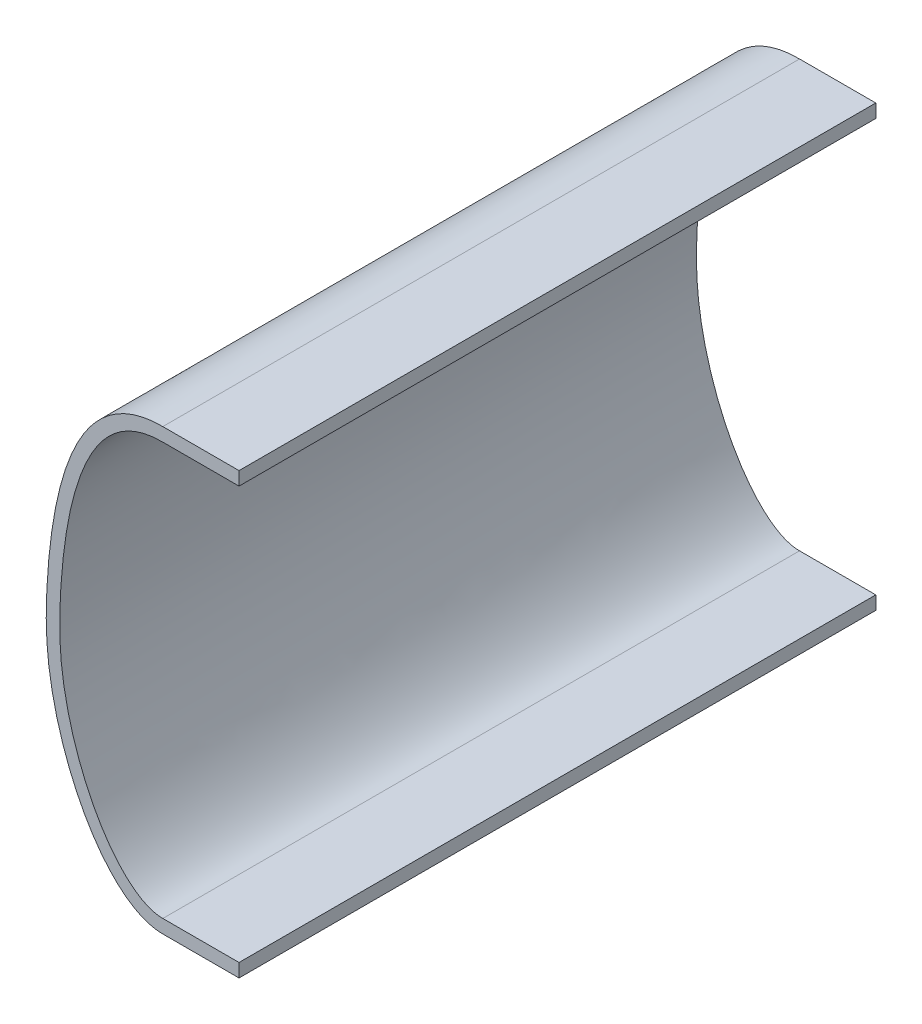
ISO-10303-21;
HEADER;
FILE_DESCRIPTION(('STEP AP214'),'2;1');
FILE_NAME('part.step','',(''),(''),'','','');
FILE_SCHEMA(('AUTOMOTIVE_DESIGN { 1 0 10303 214 1 1 1 1 }'));
ENDSEC;
DATA;
#1=APPLICATION_CONTEXT('core data for automotive mechanical design processes');
#2=APPLICATION_PROTOCOL_DEFINITION('international standard','automotive_design',2000,#1);
#3=PRODUCT_CONTEXT('',#1,'mechanical');
#4=PRODUCT('Part','Part','',(#3));
#5=PRODUCT_RELATED_PRODUCT_CATEGORY('part','',(#4));
#6=PRODUCT_DEFINITION_FORMATION('','',#4);
#7=PRODUCT_DEFINITION_CONTEXT('part definition',#1,'design');
#8=PRODUCT_DEFINITION('design','',#6,#7);
#9=PRODUCT_DEFINITION_SHAPE('','',#8);
#10=(LENGTH_UNIT() NAMED_UNIT(*) SI_UNIT(.MILLI.,.METRE.));
#11=(NAMED_UNIT(*) PLANE_ANGLE_UNIT() SI_UNIT($,.RADIAN.));
#12=(NAMED_UNIT(*) SI_UNIT($,.STERADIAN.) SOLID_ANGLE_UNIT());
#13=UNCERTAINTY_MEASURE_WITH_UNIT(LENGTH_MEASURE(1.E-05),#10,'distance_accuracy_value','');
#14=(GEOMETRIC_REPRESENTATION_CONTEXT(3) GLOBAL_UNCERTAINTY_ASSIGNED_CONTEXT((#13)) GLOBAL_UNIT_ASSIGNED_CONTEXT((#10,
#11,#12)) REPRESENTATION_CONTEXT('',''));
#15=CARTESIAN_POINT('',(0.,0.,0.));
#16=DIRECTION('',(0.,0.,1.));
#17=DIRECTION('',(1.,0.,0.));
#18=AXIS2_PLACEMENT_3D('',#15,#16,#17);
#19=CARTESIAN_POINT('',(-12.9682498047054,-1.92899742460644,71.));
#20=DIRECTION('',(0.,0.,-1.));
#21=DIRECTION('',(-1.,0.,0.));
#22=AXIS2_PLACEMENT_3D('',#19,#20,#21);
#23=PLANE('',#22);
#24=DIRECTION('',(1.,0.,0.));
#25=VECTOR('',#24,1.);
#26=CARTESIAN_POINT('',(0.,-24.5,71.));
#27=LINE('',#26,#25);
#28=CARTESIAN_POINT('',(0.,-24.5,71.));
#29=VERTEX_POINT('',#28);
#30=CARTESIAN_POINT('',(8.5,-24.5,71.));
#31=VERTEX_POINT('',#30);
#32=EDGE_CURVE('E151',#29,#31,#27,.T.);
#33=ORIENTED_EDGE('',*,*,#32,.T.);
#34=DIRECTION('',(0.,-1.,0.));
#35=VECTOR('',#34,1.);
#36=CARTESIAN_POINT('',(8.5,-24.5,71.));
#37=LINE('',#36,#35);
#38=CARTESIAN_POINT('',(8.5,-23.,71.));
#39=VERTEX_POINT('',#38);
#40=EDGE_CURVE('E155',#39,#31,#37,.T.);
#41=ORIENTED_EDGE('',*,*,#40,.F.);
#42=DIRECTION('',(1.,0.,0.));
#43=VECTOR('',#42,1.);
#44=CARTESIAN_POINT('',(-12.9682498047054,-23.,71.));
#45=LINE('',#44,#43);
#46=CARTESIAN_POINT('',(0.,-23.,71.));
#47=VERTEX_POINT('',#46);
#48=EDGE_CURVE('E169',#47,#39,#45,.T.);
#49=ORIENTED_EDGE('',*,*,#48,.F.);
#50=CARTESIAN_POINT('',(-0.0067237222128259,23.0000150695558,71.));
#51=CARTESIAN_POINT('',(-0.192366832997696,23.0008546297267,71.));
#52=CARTESIAN_POINT('',(-0.378081324979994,22.9968100373749,71.));
#53=CARTESIAN_POINT('',(-0.749414780629934,22.978166952676,71.));
#54=CARTESIAN_POINT('',(-0.93503246874514,22.9635434054905,71.));
#55=CARTESIAN_POINT('',(-1.30516858467917,22.9229319734162,71.));
#56=CARTESIAN_POINT('',(-1.48968619773364,22.8969365236255,71.));
#57=CARTESIAN_POINT('',(-1.85552329195587,22.8331178972839,71.));
#58=CARTESIAN_POINT('',(-2.03685539423349,22.7953675614577,71.));
#59=CARTESIAN_POINT('',(-2.39637488909223,22.7075499226121,71.));
#60=CARTESIAN_POINT('',(-2.57456462669481,22.657492260478,71.));
#61=CARTESIAN_POINT('',(-2.92685115288084,22.5448350330184,71.));
#62=CARTESIAN_POINT('',(-3.10094997613518,22.4822418565243,71.));
#63=CARTESIAN_POINT('',(-3.41468310176381,22.3563808576733,71.));
#64=CARTESIAN_POINT('',(-3.55510623896814,22.2950707886957,71.));
#65=CARTESIAN_POINT('',(-3.83201521613293,22.1640627278335,71.));
#66=CARTESIAN_POINT('',(-3.96850042278436,22.0943633959832,71.));
#67=CARTESIAN_POINT('',(-4.23703909832444,21.9469189732133,71.));
#68=CARTESIAN_POINT('',(-4.36909281630143,21.8691743355166,71.));
#69=CARTESIAN_POINT('',(-4.6282725576667,21.7061680631713,71.));
#70=CARTESIAN_POINT('',(-4.75540370288977,21.6209145613641,71.));
#71=CARTESIAN_POINT('',(-5.00463112246702,21.44334043489,71.));
#72=CARTESIAN_POINT('',(-5.12672727320093,21.351019636864,71.));
#73=CARTESIAN_POINT('',(-5.36572440271767,21.1598935200268,71.));
#74=CARTESIAN_POINT('',(-5.48262501373589,21.0610877434007,71.));
#75=CARTESIAN_POINT('',(-5.82029725638975,20.7603932662982,71.));
#76=CARTESIAN_POINT('',(-6.03368975096213,20.5501447989969,71.));
#77=CARTESIAN_POINT('',(-6.44074564106537,20.1114124282747,71.));
#78=CARTESIAN_POINT('',(-6.63440141721629,19.8829215426007,71.));
#79=CARTESIAN_POINT('',(-7.00360047745452,19.4108913646842,71.));
#80=CARTESIAN_POINT('',(-7.179096394388,19.1673152421571,71.));
#81=CARTESIAN_POINT('',(-7.51298857097708,18.6686368830764,71.));
#82=CARTESIAN_POINT('',(-7.67137734850881,18.4135296718257,71.));
#83=CARTESIAN_POINT('',(-7.95821610765031,17.9190729889317,71.));
#84=CARTESIAN_POINT('',(-8.08808076049961,17.6805380296065,71.));
#85=CARTESIAN_POINT('',(-8.336175040644,17.1975703481683,71.));
#86=CARTESIAN_POINT('',(-8.45440678192776,16.9531387077189,71.));
#87=CARTESIAN_POINT('',(-8.68041752168708,16.4592496536412,71.));
#88=CARTESIAN_POINT('',(-8.78818717240764,16.2097879817206,71.));
#89=CARTESIAN_POINT('',(-8.99412861639643,15.706913487957,71.));
#90=CARTESIAN_POINT('',(-9.09229921664335,15.45350017951,71.));
#91=CARTESIAN_POINT('',(-9.28026669134814,14.9424394409844,71.));
#92=CARTESIAN_POINT('',(-9.37002829461672,14.6847790796443,71.));
#93=CARTESIAN_POINT('',(-9.54150403499461,14.1667863209018,71.));
#94=CARTESIAN_POINT('',(-9.62321752511783,13.9064537105325,71.));
#95=CARTESIAN_POINT('',(-9.85722629573104,13.122530274208,71.));
#96=CARTESIAN_POINT('',(-9.99852588904571,12.5956368300576,71.));
#97=CARTESIAN_POINT('',(-10.2476470781712,11.5716228833243,71.));
#98=CARTESIAN_POINT('',(-10.3570823633811,11.0748868439966,71.));
#99=CARTESIAN_POINT('',(-10.5573526325667,10.0775502634303,71.));
#100=CARTESIAN_POINT('',(-10.6481822087466,9.57694864239852,71.));
#101=CARTESIAN_POINT('',(-10.8136566744431,8.57264519976476,71.));
#102=CARTESIAN_POINT('',(-10.8882869853104,8.06894100170128,71.));
#103=CARTESIAN_POINT('',(-11.0232880945788,7.05910585715523,71.));
#104=CARTESIAN_POINT('',(-11.0836438994721,6.55297292374723,71.));
#105=CARTESIAN_POINT('',(-11.1916648516991,5.53890937941022,71.));
#106=CARTESIAN_POINT('',(-11.2393186116798,5.03097756631906,71.));
#107=CARTESIAN_POINT('',(-11.3231338703998,4.01582395720004,71.));
#108=CARTESIAN_POINT('',(-11.3593318107429,3.50860512549087,71.));
#109=CARTESIAN_POINT('',(-11.4214979728738,2.49377840852157,71.));
#110=CARTESIAN_POINT('',(-11.4474711518151,1.98617083163078,71.));
#111=CARTESIAN_POINT('',(-11.4853459695188,0.970940117833149,71.));
#112=CARTESIAN_POINT('',(-11.4972628184678,0.463317593238425,71.));
#113=CARTESIAN_POINT('',(-11.5032328448863,-0.551484559935823,71.));
#114=CARTESIAN_POINT('',(-11.4973065732515,-1.05866402556206,71.));
#115=CARTESIAN_POINT('',(-11.4640818714594,-2.0721508369861,71.));
#116=CARTESIAN_POINT('',(-11.4367936494271,-2.57845848360947,71.));
#117=CARTESIAN_POINT('',(-11.3747591004833,-3.37286680421284,71.));
#118=CARTESIAN_POINT('',(-11.3482023174521,-3.6616216146964,71.));
#119=CARTESIAN_POINT('',(-11.287245160599,-4.23831037071538,71.));
#120=CARTESIAN_POINT('',(-11.2528446002562,-4.52624429656571,71.));
#121=CARTESIAN_POINT('',(-11.1764772610491,-5.10134451669799,71.));
#122=CARTESIAN_POINT('',(-11.1345043342422,-5.38850999339497,71.));
#123=CARTESIAN_POINT('',(-11.0432188620203,-5.96166283820638,71.));
#124=CARTESIAN_POINT('',(-10.9939063516735,-6.24765021194304,71.));
#125=CARTESIAN_POINT('',(-10.8351976547267,-7.10385122509279,71.));
#126=CARTESIAN_POINT('',(-10.7150564321735,-7.6721087087319,71.));
#127=CARTESIAN_POINT('',(-10.4471576860583,-8.80188883127782,71.));
#128=CARTESIAN_POINT('',(-10.2994072032439,-9.36341314847172,71.));
#129=CARTESIAN_POINT('',(-9.97667564827007,-10.4783527960196,71.));
#130=CARTESIAN_POINT('',(-9.80170510733444,-11.0317711722729,71.));
#131=CARTESIAN_POINT('',(-9.42428852677707,-12.1289683011289,71.));
#132=CARTESIAN_POINT('',(-9.22185306016107,-12.6727506726121,71.));
#133=CARTESIAN_POINT('',(-8.87275276066148,-13.5395944437552,71.));
#134=CARTESIAN_POINT('',(-8.73500639052666,-13.8662693878685,71.));
#135=CARTESIAN_POINT('',(-8.44848386503039,-14.5147468011459,71.));
#136=CARTESIAN_POINT('',(-8.29970816558898,-14.8365494710539,71.));
#137=CARTESIAN_POINT('',(-7.99058496512768,-15.4746452148469,71.));
#138=CARTESIAN_POINT('',(-7.83023490663882,-15.7909370517751,71.));
#139=CARTESIAN_POINT('',(-7.49780502382129,-16.4161223195863,71.));
#140=CARTESIAN_POINT('',(-7.32576105288487,-16.7250347599624,71.));
#141=CARTESIAN_POINT('',(-6.96869145917153,-17.3352156315036,71.));
#142=CARTESIAN_POINT('',(-6.78366795096419,-17.636485296957,71.));
#143=CARTESIAN_POINT('',(-6.39958475836825,-18.2297995528744,71.));
#144=CARTESIAN_POINT('',(-6.2005316687875,-18.5218483854692,71.));
#145=CARTESIAN_POINT('',(-5.8562225196091,-18.9987524473473,71.));
#146=CARTESIAN_POINT('',(-5.71529040728835,-19.1867343251108,71.));
#147=CARTESIAN_POINT('',(-5.42604957330647,-19.5569447688719,71.));
#148=CARTESIAN_POINT('',(-5.27774114885586,-19.739173566193,71.));
#149=CARTESIAN_POINT('',(-4.9727980624514,-20.0972807591802,71.));
#150=CARTESIAN_POINT('',(-4.81614485747261,-20.2731434180868,71.));
#151=CARTESIAN_POINT('',(-4.49413917132932,-20.6167377936746,71.));
#152=CARTESIAN_POINT('',(-4.32878706850327,-20.7844698633683,71.));
#153=CARTESIAN_POINT('',(-3.98665675806066,-21.1119070287886,71.));
#154=CARTESIAN_POINT('',(-3.80977047276174,-21.2714998843713,71.));
#155=CARTESIAN_POINT('',(-3.44530509851409,-21.5782235763295,71.));
#156=CARTESIAN_POINT('',(-3.25772167276122,-21.7253492973546,71.));
#157=CARTESIAN_POINT('',(-2.87154990444394,-22.0033305917676,71.));
#158=CARTESIAN_POINT('',(-2.67299484082507,-22.1342318397308,71.));
#159=CARTESIAN_POINT('',(-2.26398799793538,-22.3755123521202,71.));
#160=CARTESIAN_POINT('',(-2.05355098698039,-22.4859163912903,71.));
#161=CARTESIAN_POINT('',(-1.60851505050753,-22.6854599998364,71.));
#162=CARTESIAN_POINT('',(-1.37322461042806,-22.7731195350819,71.));
#163=CARTESIAN_POINT('',(-1.01249083276969,-22.8751603672564,71.));
#164=CARTESIAN_POINT('',(-0.891141440386347,-22.9042434113953,71.));
#165=CARTESIAN_POINT('',(-0.64635996052923,-22.9514815231774,71.));
#166=CARTESIAN_POINT('',(-0.522929503359543,-22.9696447705576,71.));
#167=CARTESIAN_POINT('',(-0.332694364203668,-22.988333682568,71.));
#168=CARTESIAN_POINT('',(-0.266288721091866,-22.9931339942946,71.));
#169=CARTESIAN_POINT('',(-0.133255723534586,-22.9992210568768,71.));
#170=CARTESIAN_POINT('',(-0.0666282206243654,-23.0005045464424,71.));
#171=CARTESIAN_POINT('',(-1.35392194715788E-07,-22.9999760442149,71.));
#172=B_SPLINE_CURVE_WITH_KNOTS('',3,(#50,#51,#52,#53,#54,#55,#56,#57,#58,#59,#60,#61,#62,#63,
#64,#65,#66,#67,#68,#69,#70,#71,#72,#73,#74,#75,#76,#77,#78,#79,#80,#81,#82,#83,#84,#85,#86,#87,
#88,#89,#90,#91,#92,#93,#94,#95,#96,#97,#98,#99,#100,#101,#102,#103,#104,#105,#106,#107,#108,
#109,#110,#111,#112,#113,#114,#115,#116,#117,#118,#119,#120,#121,#122,#123,#124,#125,#126,#127,
#128,#129,#130,#131,#132,#133,#134,#135,#136,#137,#138,#139,#140,#141,#142,#143,#144,#145,#146,
#147,#148,#149,#150,#151,#152,#153,#154,#155,#156,#157,#158,#159,#160,#161,#162,#163,#164,#165,
#166,#167,#168,#169,#170,#171),.UNSPECIFIED.,.F.,.F.,(4,2,2,2,2,2,2,2,2,2,2,2,2,2,2,2,2,2,2,2,2,
2,2,2,2,2,2,2,2,2,2,2,2,2,2,2,2,2,2,2,2,2,2,2,2,2,2,2,2,2,2,2,2,2,2,2,2,2,2,2,4),(0.,
0.556944646545095,1.11521267842954,1.67385265162518,2.22909760321496,2.78390898442731,
3.3384383176311,3.79783969346874,4.25731454429792,4.7167635252241,5.17572085717688,
5.63468945084841,6.09369048089006,6.990882463534,7.88841950639592,8.78824155872311,
9.68845558465935,10.5028978905197,11.3171919175808,12.1322069366683,12.9473231217671,
13.7657180607754,14.5841787367712,16.2198995435685,17.7454676431648,19.2714785257479,
20.7988571108726,22.3278329529317,23.8581749427675,25.3835987240138,26.9082820380799,
28.4313139925844,29.9525924593499,31.473144404064,32.3429638026875,33.2128038873227,
34.0833533924767,34.9538987383072,36.6955791242759,38.4368159620296,40.1773807968517,
41.9172774682489,42.9806879563856,44.0440545107453,45.1076567499797,46.1681335195434,
47.2284379203016,48.2882471915909,48.992924221128,49.6975728803878,50.4038585765384,
51.1101135797816,51.8243562934168,52.538890660854,53.2513654611034,53.962973413455,
54.7132184295362,55.0871787477527,55.4608585918109,55.6605125421793,55.8603515770891),.UNSPECIFIED.);
#173=CARTESIAN_POINT('',(-0.00672372221282602,23.0000075347779,71.));
#174=VERTEX_POINT('',#173);
#175=EDGE_CURVE('E173',#174,#47,#172,.T.);
#176=ORIENTED_EDGE('',*,*,#175,.F.);
#177=DIRECTION('',(-1.,0.,0.));
#178=VECTOR('',#177,1.);
#179=CARTESIAN_POINT('',(-12.9682498047054,23.,71.));
#180=LINE('',#179,#178);
#181=CARTESIAN_POINT('',(8.5,23.,71.));
#182=VERTEX_POINT('',#181);
#183=EDGE_CURVE('E165',#182,#174,#180,.T.);
#184=ORIENTED_EDGE('',*,*,#183,.F.);
#185=CARTESIAN_POINT('',(8.5,24.5,71.));
#186=VERTEX_POINT('',#185);
#187=EDGE_CURVE('E322',#186,#182,#37,.T.);
#188=ORIENTED_EDGE('',*,*,#187,.F.);
#189=DIRECTION('',(-1.,0.,0.));
#190=VECTOR('',#189,1.);
#191=CARTESIAN_POINT('',(0.,24.5,71.));
#192=LINE('',#191,#190);
#193=CARTESIAN_POINT('',(0.,24.5,71.));
#194=VERTEX_POINT('',#193);
#195=EDGE_CURVE('E67',#186,#194,#192,.T.);
#196=ORIENTED_EDGE('',*,*,#195,.T.);
#197=CARTESIAN_POINT('',(0.,24.5,71.));
#198=CARTESIAN_POINT('',(-9.74950629472076,24.5437024204093,71.));
#199=CARTESIAN_POINT('',(-12.8855353719624,10.0094717866335,71.));
#200=CARTESIAN_POINT('',(-13.2157127188795,-11.5672719883067,71.));
#201=CARTESIAN_POINT('',(-6.10038745156015,-24.5344778885819,71.));
#202=CARTESIAN_POINT('',(0.,-24.5,71.));
#203=CARTESIAN_POINT('',(0.128019035688953,-24.4992764679155,71.));
#204=CARTESIAN_POINT('',(0.256038071377867,-24.4985529358311,71.));
#205=CARTESIAN_POINT('',(0.38405710706678,-24.4978294037466,71.));
#206=B_SPLINE_CURVE_WITH_KNOTS('',3,(#197,#198,#199,#200,#201,#202,#203,#204,#205),
.UNSPECIFIED.,.F.,.F.,(4,1,1,3,4),(0.,0.42347809693051,0.52347809693051,1.,1.01),.UNSPECIFIED.);
#207=EDGE_CURVE('E91',#194,#29,#206,.T.);
#208=ORIENTED_EDGE('',*,*,#207,.T.);
#209=EDGE_LOOP('',(#33,#41,#49,#176,#184,#188,#196,#208));
#210=FACE_BOUND('',#209,.T.);
#211=ADVANCED_FACE('F39',(#210),#23,.F.);
#212=DIRECTION('',(0.,0.,-1.));
#213=VECTOR('',#212,1.);
#214=SURFACE_OF_LINEAR_EXTRUSION('',#206,#213);
#215=CARTESIAN_POINT('',(0.,24.5,0.));
#216=CARTESIAN_POINT('',(-9.74950629472076,24.5437024204093,0.));
#217=CARTESIAN_POINT('',(-12.8855353719624,10.0094717866335,0.));
#218=CARTESIAN_POINT('',(-13.2157127188795,-11.5672719883067,0.));
#219=CARTESIAN_POINT('',(-6.10038745156015,-24.5344778885819,0.));
#220=CARTESIAN_POINT('',(0.,-24.5,0.));
#221=B_SPLINE_CURVE_WITH_KNOTS('',3,(#215,#216,#217,#218,#219,#220),.UNSPECIFIED.,.F.,.F.,(4,1,
1,4),(0.,0.42347809693051,0.52347809693051,1.),.UNSPECIFIED.);
#222=CARTESIAN_POINT('',(0.,24.5,0.));
#223=VERTEX_POINT('',#222);
#224=CARTESIAN_POINT('',(0.,-24.5,0.));
#225=VERTEX_POINT('',#224);
#226=EDGE_CURVE('E98',#223,#225,#221,.T.);
#227=ORIENTED_EDGE('',*,*,#226,.T.);
#228=DIRECTION('',(0.,0.,-1.));
#229=VECTOR('',#228,1.);
#230=CARTESIAN_POINT('',(0.,-24.5,71.));
#231=LINE('',#230,#229);
#232=EDGE_CURVE('E11',#29,#225,#231,.T.);
#233=ORIENTED_EDGE('',*,*,#232,.F.);
#234=ORIENTED_EDGE('',*,*,#207,.F.);
#235=DIRECTION('',(0.,0.,-1.));
#236=VECTOR('',#235,1.);
#237=CARTESIAN_POINT('',(0.,24.5,71.));
#238=LINE('',#237,#236);
#239=EDGE_CURVE('E50',#194,#223,#238,.T.);
#240=ORIENTED_EDGE('',*,*,#239,.T.);
#241=EDGE_LOOP('',(#227,#233,#234,#240));
#242=FACE_BOUND('',#241,.T.);
#243=ADVANCED_FACE('F96',(#242),#214,.F.);
#244=CARTESIAN_POINT('',(0.,-24.5,71.));
#245=DIRECTION('',(0.,1.,0.));
#246=DIRECTION('',(0.,0.,1.));
#247=AXIS2_PLACEMENT_3D('',#244,#245,#246);
#248=PLANE('',#247);
#249=DIRECTION('',(1.,0.,0.));
#250=VECTOR('',#249,1.);
#251=CARTESIAN_POINT('',(0.,-24.5,0.));
#252=LINE('',#251,#250);
#253=CARTESIAN_POINT('',(8.5,-24.5,0.));
#254=VERTEX_POINT('',#253);
#255=EDGE_CURVE('E92',#225,#254,#252,.T.);
#256=ORIENTED_EDGE('',*,*,#255,.T.);
#257=DIRECTION('',(0.,0.,1.));
#258=VECTOR('',#257,1.);
#259=CARTESIAN_POINT('',(8.5,-24.5,-0.0749250749250696));
#260=LINE('',#259,#258);
#261=EDGE_CURVE('E300',#254,#31,#260,.T.);
#262=ORIENTED_EDGE('',*,*,#261,.T.);
#263=ORIENTED_EDGE('',*,*,#32,.F.);
#264=ORIENTED_EDGE('',*,*,#232,.T.);
#265=EDGE_LOOP('',(#256,#262,#263,#264));
#266=FACE_BOUND('',#265,.T.);
#267=ADVANCED_FACE('F41',(#266),#248,.F.);
#268=CARTESIAN_POINT('',(0.,24.5,71.));
#269=DIRECTION('',(0.,-1.,0.));
#270=DIRECTION('',(0.,0.,-1.));
#271=AXIS2_PLACEMENT_3D('',#268,#269,#270);
#272=PLANE('',#271);
#273=ORIENTED_EDGE('',*,*,#195,.F.);
#274=DIRECTION('',(0.,0.,1.));
#275=VECTOR('',#274,1.);
#276=CARTESIAN_POINT('',(8.5,24.5,-0.0749250749250696));
#277=LINE('',#276,#275);
#278=CARTESIAN_POINT('',(8.5,24.5,0.));
#279=VERTEX_POINT('',#278);
#280=EDGE_CURVE('E87',#279,#186,#277,.T.);
#281=ORIENTED_EDGE('',*,*,#280,.F.);
#282=DIRECTION('',(-1.,0.,0.));
#283=VECTOR('',#282,1.);
#284=CARTESIAN_POINT('',(0.,24.5,0.));
#285=LINE('',#284,#283);
#286=EDGE_CURVE('E81',#279,#223,#285,.T.);
#287=ORIENTED_EDGE('',*,*,#286,.T.);
#288=ORIENTED_EDGE('',*,*,#239,.F.);
#289=EDGE_LOOP('',(#273,#281,#287,#288));
#290=FACE_BOUND('',#289,.T.);
#291=ADVANCED_FACE('F83',(#290),#272,.F.);
#292=CARTESIAN_POINT('',(-12.9682498047054,-1.92899742460644,0.));
#293=DIRECTION('',(0.,0.,-1.));
#294=DIRECTION('',(-1.,0.,0.));
#295=AXIS2_PLACEMENT_3D('',#292,#293,#294);
#296=PLANE('',#295);
#297=DIRECTION('',(0.,1.,0.));
#298=VECTOR('',#297,1.);
#299=CARTESIAN_POINT('',(8.5,-1.92899742460644,0.));
#300=LINE('',#299,#298);
#301=CARTESIAN_POINT('',(8.50000000000001,-23.,0.));
#302=VERTEX_POINT('',#301);
#303=EDGE_CURVE('E58',#254,#302,#300,.T.);
#304=ORIENTED_EDGE('',*,*,#303,.F.);
#305=ORIENTED_EDGE('',*,*,#255,.F.);
#306=ORIENTED_EDGE('',*,*,#226,.F.);
#307=ORIENTED_EDGE('',*,*,#286,.F.);
#308=CARTESIAN_POINT('',(8.5,23.,0.));
#309=VERTEX_POINT('',#308);
#310=EDGE_CURVE('E252',#309,#279,#300,.T.);
#311=ORIENTED_EDGE('',*,*,#310,.F.);
#312=DIRECTION('',(-0.999999999998431,1.77148762801781E-06,0.));
#313=VECTOR('',#312,1.);
#314=CARTESIAN_POINT('',(8.5,23.,0.));
#315=LINE('',#314,#313);
#316=CARTESIAN_POINT('',(-0.0067237222128259,23.0000150695558,0.));
#317=VERTEX_POINT('',#316);
#318=EDGE_CURVE('E249',#309,#317,#315,.T.);
#319=ORIENTED_EDGE('',*,*,#318,.T.);
#320=CARTESIAN_POINT('',(-0.00423878158636574,-23.,0.));
#321=CARTESIAN_POINT('',(-0.0759748044289641,-23.0004958272955,0.));
#322=CARTESIAN_POINT('',(-0.147717105417957,-22.9988822787626,0.));
#323=CARTESIAN_POINT('',(-0.29126649180994,-22.9915662319807,0.));
#324=CARTESIAN_POINT('',(-0.363072794664041,-22.9858482805008,0.));
#325=CARTESIAN_POINT('',(-0.507327483552532,-22.9703363866153,0.));
#326=CARTESIAN_POINT('',(-0.579769396014185,-22.9604827243402,0.));
#327=CARTESIAN_POINT('',(-0.725433160099027,-22.9366736617349,0.));
#328=CARTESIAN_POINT('',(-0.798642414327325,-22.9226415537605,0.));
#329=CARTESIAN_POINT('',(-0.945938299181167,-22.8904262632166,0.));
#330=CARTESIAN_POINT('',(-1.02000524111367,-22.8721534471097,0.));
#331=CARTESIAN_POINT('',(-1.16907521313707,-22.8313981183292,0.));
#332=CARTESIAN_POINT('',(-1.24405119879661,-22.8088170575237,0.));
#333=CARTESIAN_POINT('',(-1.39496075595967,-22.7593839066133,0.));
#334=CARTESIAN_POINT('',(-1.47086019290695,-22.732427962121,0.));
#335=CARTESIAN_POINT('',(-1.62360491261176,-22.674187986314,0.));
#336=CARTESIAN_POINT('',(-1.70040963629654,-22.642797905727,0.));
#337=CARTESIAN_POINT('',(-1.85492476404911,-22.5756417011919,0.));
#338=CARTESIAN_POINT('',(-1.93258909992148,-22.5397698753112,0.));
#339=CARTESIAN_POINT('',(-2.08876013852724,-22.4636146767351,0.));
#340=CARTESIAN_POINT('',(-2.16721630424623,-22.4232279292831,0.));
#341=CARTESIAN_POINT('',(-2.32488972555586,-22.3380217180119,0.));
#342=CARTESIAN_POINT('',(-2.40405304047233,-22.2931026671974,0.));
#343=CARTESIAN_POINT('',(-2.5630462972938,-22.1988257399692,0.));
#344=CARTESIAN_POINT('',(-2.64281991384865,-22.1493730739527,0.));
#345=CARTESIAN_POINT('',(-2.80293030559397,-22.0460377091051,0.));
#346=CARTESIAN_POINT('',(-2.88320929843353,-21.9920656537777,0.));
#347=CARTESIAN_POINT('',(-3.04422144317765,-21.8797144467621,0.));
#348=CARTESIAN_POINT('',(-3.12489616707455,-21.8212517103192,0.));
#349=CARTESIAN_POINT('',(-3.28658813097312,-21.6999550438743,0.));
#350=CARTESIAN_POINT('',(-3.36754698657154,-21.6370434110837,0.));
#351=CARTESIAN_POINT('',(-3.5296948117602,-21.5068965881397,0.));
#352=CARTESIAN_POINT('',(-3.61082599895623,-21.4395895232552,0.));
#353=CARTESIAN_POINT('',(-3.77320811148895,-21.3007093392041,0.));
#354=CARTESIAN_POINT('',(-3.85440233364983,-21.2290699888546,0.));
#355=CARTESIAN_POINT('',(-4.01679883451174,-21.0815929646491,0.));
#356=CARTESIAN_POINT('',(-4.09794574411987,-21.005694487139,0.));
#357=CARTESIAN_POINT('',(-4.34422636517114,-20.7689514402089,0.));
#358=CARTESIAN_POINT('',(-4.50589122194619,-20.6044820748253,0.));
#359=CARTESIAN_POINT('',(-4.82822926557454,-20.2599357746432,0.));
#360=CARTESIAN_POINT('',(-4.98850403276066,-20.0794886631929,0.));
#361=CARTESIAN_POINT('',(-5.30732038442093,-19.703670736481,0.));
#362=CARTESIAN_POINT('',(-5.4654975761105,-19.5079916308939,0.));
#363=CARTESIAN_POINT('',(-5.77941995203741,-19.1024658965203,0.));
#364=CARTESIAN_POINT('',(-5.93483432537469,-18.8923640373879,0.));
#365=CARTESIAN_POINT('',(-6.24259109111917,-18.4587776728404,0.));
#366=CARTESIAN_POINT('',(-6.39463543035975,-18.235082163963,0.));
#367=CARTESIAN_POINT('',(-6.69505866239737,-17.7751175296556,0.));
#368=CARTESIAN_POINT('',(-6.84317048538404,-17.538674382961,0.));
#369=CARTESIAN_POINT('',(-7.13517667101325,-17.0540372833922,0.));
#370=CARTESIAN_POINT('',(-7.27883293246111,-16.8057001639671,0.));
#371=CARTESIAN_POINT('',(-7.56141089033682,-16.2981065783291,0.));
#372=CARTESIAN_POINT('',(-7.70012137734934,-16.038732738765,0.));
#373=CARTESIAN_POINT('',(-7.9723193509112,-15.5099029338903,0.));
#374=CARTESIAN_POINT('',(-8.10562052475446,-15.2403512346264,0.));
#375=CARTESIAN_POINT('',(-8.36653856697474,-14.6920031334509,0.));
#376=CARTESIAN_POINT('',(-8.49399227517928,-14.4131291522424,0.));
#377=CARTESIAN_POINT('',(-8.74276488192328,-13.8469857022271,0.));
#378=CARTESIAN_POINT('',(-8.86394202327068,-13.5596541711833,0.));
#379=CARTESIAN_POINT('',(-9.21996076156162,-12.6806467657587,0.));
#380=CARTESIAN_POINT('',(-9.44175603034252,-12.0836379130714,0.));
#381=CARTESIAN_POINT('',(-9.85636023229772,-10.8663347556684,0.));
#382=CARTESIAN_POINT('',(-10.0484989243753,-10.2458135750154,0.));
#383=CARTESIAN_POINT('',(-10.4006032759381,-8.98811188548854,0.));
#384=CARTESIAN_POINT('',(-10.5601788820974,-8.35082222064432,0.));
#385=CARTESIAN_POINT('',(-10.8441371894941,-7.06625244644458,0.));
#386=CARTESIAN_POINT('',(-10.968405703844,-6.41894690403809,0.));
#387=CARTESIAN_POINT('',(-11.1264111790055,-5.44427281424422,0.));
#388=CARTESIAN_POINT('',(-11.1743069140526,-5.1191483005807,0.));
#389=CARTESIAN_POINT('',(-11.2602458236399,-4.46895551781199,0.));
#390=CARTESIAN_POINT('',(-11.298328955292,-4.14389258513249,0.));
#391=CARTESIAN_POINT('',(-11.3642359965312,-3.49445076512597,0.));
#392=CARTESIAN_POINT('',(-11.3921127177448,-3.17007724621224,0.));
#393=CARTESIAN_POINT('',(-11.4379638083026,-2.52072538699113,0.));
#394=CARTESIAN_POINT('',(-11.4559407302596,-2.19574722429283,0.));
#395=CARTESIAN_POINT('',(-11.4965220881632,-1.21413260559644,0.));
#396=CARTESIAN_POINT('',(-11.5051829876905,-0.556902898822726,0.));
#397=CARTESIAN_POINT('',(-11.4929770120239,0.774303339772823,0.));
#398=CARTESIAN_POINT('',(-11.471332231736,1.44826847178932,0.));
#399=CARTESIAN_POINT('',(-11.4220834052781,2.46775957241069,0.));
#400=CARTESIAN_POINT('',(-11.4024884220034,2.81371367160816,0.));
#401=CARTESIAN_POINT('',(-11.3582224720696,3.51122179221928,0.));
#402=CARTESIAN_POINT('',(-11.3334706333049,3.86277069037952,0.));
#403=CARTESIAN_POINT('',(-11.2504093917305,4.92743887999139,0.));
#404=CARTESIAN_POINT('',(-11.1837986157373,5.63994065264321,0.));
#405=CARTESIAN_POINT('',(-11.0243264643637,7.06761595718269,0.));
#406=CARTESIAN_POINT('',(-10.9312658216078,7.78276745828374,0.));
#407=CARTESIAN_POINT('',(-10.7148230903738,9.20399624495001,0.));
#408=CARTESIAN_POINT('',(-10.5916357702068,9.910102313808,0.));
#409=CARTESIAN_POINT('',(-10.3799969476174,10.959027622455,0.));
#410=CARTESIAN_POINT('',(-10.305557528763,11.3046937851015,0.));
#411=CARTESIAN_POINT('',(-10.1477092737353,11.9891966628738,0.));
#412=CARTESIAN_POINT('',(-10.0644314499799,12.3280633718693,0.));
#413=CARTESIAN_POINT('',(-9.8885096948593,12.9974307054064,0.));
#414=CARTESIAN_POINT('',(-9.79604176420433,13.3279773925653,0.));
#415=CARTESIAN_POINT('',(-9.60136590978509,13.9791682549466,0.));
#416=CARTESIAN_POINT('',(-9.49938395110148,14.299879641655,0.));
#417=CARTESIAN_POINT('',(-9.28535152044279,14.9298599979629,0.));
#418=CARTESIAN_POINT('',(-9.17358114305371,15.2392236640891,0.));
#419=CARTESIAN_POINT('',(-8.93969197600717,15.8449813659485,0.));
#420=CARTESIAN_POINT('',(-8.81791035665188,16.1415048568984,0.));
#421=CARTESIAN_POINT('',(-8.56378303450015,16.7200706820305,0.));
#422=CARTESIAN_POINT('',(-8.43183189804397,17.002285601445,0.));
#423=CARTESIAN_POINT('',(-8.1571966214382,17.5508088819591,0.));
#424=CARTESIAN_POINT('',(-8.01496141539459,17.8173399431159,0.));
#425=CARTESIAN_POINT('',(-7.79171510320806,18.2072720486054,0.));
#426=CARTESIAN_POINT('',(-7.7166403370108,18.3340907964467,0.));
#427=CARTESIAN_POINT('',(-7.56384615550745,18.583273338622,0.));
#428=CARTESIAN_POINT('',(-7.48619048292299,18.7056760951766,0.));
#429=CARTESIAN_POINT('',(-7.32823727362812,18.9458767880856,0.));
#430=CARTESIAN_POINT('',(-7.24800470936269,19.0637174056163,0.));
#431=CARTESIAN_POINT('',(-7.08489743351941,19.2946597374919,0.));
#432=CARTESIAN_POINT('',(-7.00208809596728,19.4078075512099,0.));
#433=CARTESIAN_POINT('',(-6.8338269608379,19.6292421985091,0.));
#434=CARTESIAN_POINT('',(-6.74843985577997,19.7375781194977,0.));
#435=CARTESIAN_POINT('',(-6.57501929380466,19.9492817586484,0.));
#436=CARTESIAN_POINT('',(-6.48704861470658,20.0527008275323,0.));
#437=CARTESIAN_POINT('',(-6.30845096680895,20.2544791570684,0.));
#438=CARTESIAN_POINT('',(-6.21788347326946,20.3528909853682,0.));
#439=CARTESIAN_POINT('',(-6.03407285590813,20.5445795702447,0.));
#440=CARTESIAN_POINT('',(-5.94088441002991,20.6379086846881,0.));
#441=CARTESIAN_POINT('',(-5.75179952314632,20.8193728139148,0.));
#442=CARTESIAN_POINT('',(-5.65595142376899,20.9075581330545,0.));
#443=CARTESIAN_POINT('',(-5.46149799546059,21.07869088951,0.));
#444=CARTESIAN_POINT('',(-5.3629331778454,21.1616843004221,0.));
#445=CARTESIAN_POINT('',(-5.16297643971467,21.3224026183561,0.));
#446=CARTESIAN_POINT('',(-5.06161586227734,21.40016647506,0.));
#447=CARTESIAN_POINT('',(-4.85597372930037,21.5504049528589,0.));
#448=CARTESIAN_POINT('',(-4.75171329340469,21.6229084517114,0.));
#449=CARTESIAN_POINT('',(-4.54015100325389,21.7626109300073,0.));
#450=CARTESIAN_POINT('',(-4.43285940276568,21.8298254237636,0.));
#451=CARTESIAN_POINT('',(-4.21508640987752,21.9589346010954,0.));
#452=CARTESIAN_POINT('',(-4.10460429240831,22.020828062512,0.));
#453=CARTESIAN_POINT('',(-3.88027412281135,22.1392737290444,0.));
#454=CARTESIAN_POINT('',(-3.76641486750393,22.1958047252613,0.));
#455=CARTESIAN_POINT('',(-3.53512841746501,22.3034914800626,0.));
#456=CARTESIAN_POINT('',(-3.41768068952686,22.3546031440769,0.));
#457=CARTESIAN_POINT('',(-3.17899310651154,22.4513986621544,0.));
#458=CARTESIAN_POINT('',(-3.05772515436294,22.4970132151237,0.));
#459=CARTESIAN_POINT('',(-2.81115600403464,22.582738191237,0.));
#460=CARTESIAN_POINT('',(-2.68582143389568,22.6227525588414,0.));
#461=CARTESIAN_POINT('',(-2.43086746049056,22.6971733291977,0.));
#462=CARTESIAN_POINT('',(-2.30121207014545,22.7314562816828,0.));
#463=CARTESIAN_POINT('',(-2.03736138106053,22.7942808680118,0.));
#464=CARTESIAN_POINT('',(-1.90313031775389,22.8226719799684,0.));
#465=CARTESIAN_POINT('',(-1.62987712898216,22.8735497680415,0.));
#466=CARTESIAN_POINT('',(-1.49082228393447,22.8958601034013,0.));
#467=CARTESIAN_POINT('',(-1.20767945366654,22.9343853878896,0.));
#468=CARTESIAN_POINT('',(-1.06356436735647,22.9504002605848,0.));
#469=CARTESIAN_POINT('',(-0.770078560660262,22.9761176533648,0.));
#470=CARTESIAN_POINT('',(-0.620688724464277,22.9855990568148,0.));
#471=CARTESIAN_POINT('',(-0.316434461429303,22.9980155967459,0.));
#472=CARTESIAN_POINT('',(-0.161560133403905,23.0007118843671,0.));
#473=CARTESIAN_POINT('',(-0.00672372226365283,23.0000150695561,0.));
#474=B_SPLINE_CURVE_WITH_KNOTS('',3,(#320,#321,#322,#323,#324,#325,#326,#327,#328,#329,#330,
#331,#332,#333,#334,#335,#336,#337,#338,#339,#340,#341,#342,#343,#344,#345,#346,#347,#348,#349,
#350,#351,#352,#353,#354,#355,#356,#357,#358,#359,#360,#361,#362,#363,#364,#365,#366,#367,#368,
#369,#370,#371,#372,#373,#374,#375,#376,#377,#378,#379,#380,#381,#382,#383,#384,#385,#386,#387,
#388,#389,#390,#391,#392,#393,#394,#395,#396,#397,#398,#399,#400,#401,#402,#403,#404,#405,#406,
#407,#408,#409,#410,#411,#412,#413,#414,#415,#416,#417,#418,#419,#420,#421,#422,#423,#424,#425,
#426,#427,#428,#429,#430,#431,#432,#433,#434,#435,#436,#437,#438,#439,#440,#441,#442,#443,#444,
#445,#446,#447,#448,#449,#450,#451,#452,#453,#454,#455,#456,#457,#458,#459,#460,#461,#462,#463,
#464,#465,#466,#467,#468,#469,#470,#471,#472,#473),.UNSPECIFIED.,.F.,.F.,(4,2,2,2,2,2,2,2,2,2,2,
2,2,2,2,2,2,2,2,2,2,2,2,2,2,2,2,2,2,2,2,2,2,2,2,2,2,2,2,2,2,2,2,2,2,2,2,2,2,2,2,2,2,2,2,2,2,2,2,
2,2,2,2,2,2,2,2,2,2,2,2,2,2,2,2,2,4),(0.,0.215170295385935,0.431154993042086,0.650372079119733,
0.873891659317319,1.10265322989599,1.33746451176176,1.57900506466993,1.82783351948619,
2.0843972321998,2.34904328035142,2.62202991008174,2.90353777018903,3.19368048147396,
3.4925142737542,3.80004656342009,4.1162434501864,4.44103617469734,4.77432662148605,
5.4658279185774,6.18960235527401,6.94419542143392,7.72798053254238,8.53920661763337,
9.37603175903287,10.2365474048028,11.1187962238881,12.0207856664003,12.9404986223895,
13.8759021229358,15.7854226294516,17.7332241230358,19.7031405004539,21.6793571037325,
22.6651397822636,23.6468425271862,24.6233912951738,25.5996881470124,27.570600832952,
29.5930417932339,30.6325428009617,31.6897727014693,33.8361732598078,35.9991936164105,
38.1485835364422,39.2092353128613,40.2559208520755,41.28544090921,42.2948179141085,
43.2813515181995,44.2426912059344,45.1769313960239,46.0827354855566,46.5248003576919,
46.9595999345864,47.3872052877583,47.8077603852925,48.2214904775343,48.6287108013651,
49.0298353221639,49.4253851284055,49.8159959816219,50.2024244306432,50.5855518272743,
50.9663855733938,51.3460569939015,51.7258153873775,52.1070180639624,52.4911165071733,
52.879639163985,53.2741717120731,53.6763359216184,54.0877683614379,54.510100181792,
54.9449390361371,55.3938539275268,55.8583634211047),.UNSPECIFIED.);
#475=CARTESIAN_POINT('',(-0.00423878158005929,-23.,0.));
#476=VERTEX_POINT('',#475);
#477=EDGE_CURVE('E121',#317,#476,#474,.F.);
#478=ORIENTED_EDGE('',*,*,#477,.T.);
#479=DIRECTION('',(1.,0.,0.));
#480=VECTOR('',#479,1.);
#481=CARTESIAN_POINT('',(0.,-23.,0.));
#482=LINE('',#481,#480);
#483=EDGE_CURVE('E247',#476,#302,#482,.T.);
#484=ORIENTED_EDGE('',*,*,#483,.T.);
#485=EDGE_LOOP('',(#304,#305,#306,#307,#311,#319,#478,#484));
#486=FACE_BOUND('',#485,.T.);
#487=ADVANCED_FACE('F100',(#486),#296,.T.);
#488=CARTESIAN_POINT('',(0.,24.5,71.));
#489=CARTESIAN_POINT('',(-9.74950629472076,24.5437024204093,71.));
#490=CARTESIAN_POINT('',(-12.8855353719624,10.0094717866335,71.));
#491=CARTESIAN_POINT('',(-13.2157127188795,-11.5672719883067,71.));
#492=CARTESIAN_POINT('',(-6.10038745156015,-24.5344778885819,71.));
#493=CARTESIAN_POINT('',(0.128019035688953,-24.4992764679155,71.));
#494=CARTESIAN_POINT('',(0.256038071377867,-24.4985529358311,71.));
#495=CARTESIAN_POINT('',(0.38405710706678,-24.4978294037466,71.));
#496=B_SPLINE_CURVE_WITH_KNOTS('',3,(#488,#489,#490,#491,#492,#493,#494,#495),.UNSPECIFIED.,.F.,
.F.,(4,1,1,2,4),(0.,0.42347809693051,0.52347809693051,1.,1.01),.UNSPECIFIED.);
#497=DIRECTION('',(0.,0.,-1.));
#498=VECTOR('',#497,1.);
#499=SURFACE_OF_LINEAR_EXTRUSION('',#496,#498);
#500=OFFSET_SURFACE('',#499,1.5,.F.);
#501=CARTESIAN_POINT('',(-0.00847472178794391,-23.0000239404942,71.));
#502=CARTESIAN_POINT('',(-0.00847472178794391,-23.0000239404942,68.1041666666667));
#503=CARTESIAN_POINT('',(-0.00847472178794391,-23.0000239404942,65.2083333333333));
#504=CARTESIAN_POINT('',(-0.00847472178794391,-23.0000239404942,59.4166666666667));
#505=CARTESIAN_POINT('',(-0.00847472178794391,-23.0000239404942,56.5208333333333));
#506=CARTESIAN_POINT('',(-0.00847472178794391,-23.0000239404942,50.7291666666667));
#507=CARTESIAN_POINT('',(-0.00847472178794391,-23.0000239404942,47.8333333333333));
#508=CARTESIAN_POINT('',(-0.00847472178794391,-23.0000239404942,42.0416666666667));
#509=CARTESIAN_POINT('',(-0.00847472178794391,-23.0000239404942,39.1458333333333));
#510=CARTESIAN_POINT('',(-0.00847472178794391,-23.0000239404942,33.3541666666667));
#511=CARTESIAN_POINT('',(-0.00847472178794391,-23.0000239404942,30.4583333333333));
#512=CARTESIAN_POINT('',(-0.00847472178794391,-23.0000239404942,24.6666666666667));
#513=CARTESIAN_POINT('',(-0.00847472178794391,-23.0000239404942,21.7708333333333));
#514=CARTESIAN_POINT('',(-0.00847472178794391,-23.0000239404942,15.9791666666667));
#515=CARTESIAN_POINT('',(-0.00847472178794391,-23.0000239404942,13.0833333333333));
#516=CARTESIAN_POINT('',(-0.00847472178794391,-23.0000239404942,7.29166666666667));
#517=CARTESIAN_POINT('',(-0.00847472178794391,-23.0000239404942,4.39583333333334));
#518=CARTESIAN_POINT('',(-0.00847472178794391,-23.0000239404942,1.5));
#519=B_SPLINE_CURVE_WITH_KNOTS('',3,(#501,#502,#503,#504,#505,#506,#507,#508,#509,#510,#511,
#512,#513,#514,#515,#516,#517,#518),.UNSPECIFIED.,.F.,.F.,(4,2,2,2,2,2,2,2,4),(0.,8.6875,17.375,
26.0625,34.75,43.4375,52.125,60.8125,69.5),.UNSPECIFIED.);
#520=CARTESIAN_POINT('',(-0.00211939079002791,-23.,1.5));
#521=VERTEX_POINT('',#520);
#522=EDGE_CURVE('E102',#47,#521,#519,.T.);
#523=ORIENTED_EDGE('',*,*,#522,.T.);
#524=DIRECTION('',(0.,0.,-1.));
#525=VECTOR('',#524,1.);
#526=CARTESIAN_POINT('',(-0.00423878157952627,-23.,0.750000000000001));
#527=LINE('',#526,#525);
#528=EDGE_CURVE('E243',#476,#521,#527,.F.);
#529=ORIENTED_EDGE('',*,*,#528,.F.);
#530=ORIENTED_EDGE('',*,*,#477,.F.);
#531=DIRECTION('',(0.,0.,-1.));
#532=VECTOR('',#531,1.);
#533=CARTESIAN_POINT('',(-0.0067237222128259,23.0000150695558,0.750000000000001));
#534=LINE('',#533,#532);
#535=CARTESIAN_POINT('',(-0.0067237222128259,23.0000150695558,1.5));
#536=VERTEX_POINT('',#535);
#537=EDGE_CURVE('E241',#317,#536,#534,.F.);
#538=ORIENTED_EDGE('',*,*,#537,.T.);
#539=CARTESIAN_POINT('',(-0.00672372226365281,23.0000150695561,1.5));
#540=CARTESIAN_POINT('',(-0.00672372226365281,23.0000150695561,4.39583333333334));
#541=CARTESIAN_POINT('',(-0.00672372226365281,23.0000150695561,7.29166666666667));
#542=CARTESIAN_POINT('',(-0.00672372226365281,23.0000150695561,13.0833333333333));
#543=CARTESIAN_POINT('',(-0.00672372226365281,23.0000150695561,15.9791666666667));
#544=CARTESIAN_POINT('',(-0.00672372226365281,23.0000150695561,21.7708333333333));
#545=CARTESIAN_POINT('',(-0.00672372226365281,23.0000150695561,24.6666666666667));
#546=CARTESIAN_POINT('',(-0.00672372226365281,23.0000150695561,30.4583333333333));
#547=CARTESIAN_POINT('',(-0.00672372226365281,23.0000150695561,33.3541666666667));
#548=CARTESIAN_POINT('',(-0.00672372226365281,23.0000150695561,39.1458333333333));
#549=CARTESIAN_POINT('',(-0.00672372226365281,23.0000150695561,42.0416666666667));
#550=CARTESIAN_POINT('',(-0.00672372226365281,23.0000150695561,47.8333333333333));
#551=CARTESIAN_POINT('',(-0.00672372226365281,23.0000150695561,50.7291666666667));
#552=CARTESIAN_POINT('',(-0.00672372226365281,23.0000150695561,56.5208333333333));
#553=CARTESIAN_POINT('',(-0.00672372226365281,23.0000150695561,59.4166666666667));
#554=CARTESIAN_POINT('',(-0.00672372226365281,23.0000150695561,65.2083333333333));
#555=CARTESIAN_POINT('',(-0.00672372226365281,23.0000150695561,68.1041666666667));
#556=CARTESIAN_POINT('',(-0.00672372226365281,23.0000150695561,71.));
#557=B_SPLINE_CURVE_WITH_KNOTS('',3,(#539,#540,#541,#542,#543,#544,#545,#546,#547,#548,#549,
#550,#551,#552,#553,#554,#555,#556),.UNSPECIFIED.,.F.,.F.,(4,2,2,2,2,2,2,2,4),(0.,8.6875,17.375,
26.0625,34.75,43.4375,52.125,60.8125,69.5),.UNSPECIFIED.);
#558=EDGE_CURVE('E168',#174,#536,#557,.F.);
#559=ORIENTED_EDGE('',*,*,#558,.F.);
#560=ORIENTED_EDGE('',*,*,#175,.T.);
#561=EDGE_LOOP('',(#523,#529,#530,#538,#559,#560));
#562=FACE_BOUND('',#561,.T.);
#563=ADVANCED_FACE('F136',(#562),#500,.T.);
#564=CARTESIAN_POINT('',(0.,-23.,71.));
#565=DIRECTION('',(0.,1.,0.));
#566=DIRECTION('',(0.,0.,1.));
#567=AXIS2_PLACEMENT_3D('',#564,#565,#566);
#568=PLANE('',#567);
#569=DIRECTION('',(0.,0.,-1.));
#570=VECTOR('',#569,1.);
#571=CARTESIAN_POINT('',(8.5,-23.,71.));
#572=LINE('',#571,#570);
#573=EDGE_CURVE('E106',#39,#302,#572,.T.);
#574=ORIENTED_EDGE('',*,*,#573,.T.);
#575=ORIENTED_EDGE('',*,*,#483,.F.);
#576=ORIENTED_EDGE('',*,*,#528,.T.);
#577=ORIENTED_EDGE('',*,*,#522,.F.);
#578=ORIENTED_EDGE('',*,*,#48,.T.);
#579=EDGE_LOOP('',(#574,#575,#576,#577,#578));
#580=FACE_BOUND('',#579,.T.);
#581=ADVANCED_FACE('F187',(#580),#568,.T.);
#582=CARTESIAN_POINT('',(0.,23.,71.));
#583=DIRECTION('',(0.,-1.,0.));
#584=DIRECTION('',(0.,0.,-1.));
#585=AXIS2_PLACEMENT_3D('',#582,#583,#584);
#586=PLANE('',#585);
#587=CARTESIAN_POINT('',(8.5,23.,1.5));
#588=DIRECTION('',(-0.999999999998431,1.77148762801782E-06,0.));
#589=VECTOR('',#588,1.);
#590=LINE('',#587,#589);
#591=CARTESIAN_POINT('',(8.5,23.,1.5));
#592=VERTEX_POINT('',#591);
#593=EDGE_CURVE('E274',#592,#536,#590,.T.);
#594=ORIENTED_EDGE('',*,*,#593,.F.);
#595=DIRECTION('',(0.,0.,-1.));
#596=VECTOR('',#595,1.);
#597=CARTESIAN_POINT('',(8.5,23.,71.));
#598=LINE('',#597,#596);
#599=EDGE_CURVE('E228',#182,#592,#598,.T.);
#600=ORIENTED_EDGE('',*,*,#599,.F.);
#601=ORIENTED_EDGE('',*,*,#183,.T.);
#602=ORIENTED_EDGE('',*,*,#558,.T.);
#603=EDGE_LOOP('',(#594,#600,#601,#602));
#604=FACE_BOUND('',#603,.T.);
#605=ADVANCED_FACE('F215',(#604),#586,.T.);
#606=CARTESIAN_POINT('',(8.5,23.,0.));
#607=DIRECTION('',(1.77148762801781E-06,0.999999999998431,0.));
#608=DIRECTION('',(-0.999999999998431,1.77148762801781E-06,0.));
#609=AXIS2_PLACEMENT_3D('',#606,#607,#608);
#610=PLANE('',#609);
#611=ORIENTED_EDGE('',*,*,#593,.T.);
#612=ORIENTED_EDGE('',*,*,#537,.F.);
#613=ORIENTED_EDGE('',*,*,#318,.F.);
#614=DIRECTION('',(0.,0.,1.));
#615=VECTOR('',#614,1.);
#616=CARTESIAN_POINT('',(8.5,23.,0.));
#617=LINE('',#616,#615);
#618=EDGE_CURVE('E256',#309,#592,#617,.T.);
#619=ORIENTED_EDGE('',*,*,#618,.T.);
#620=EDGE_LOOP('',(#611,#612,#613,#619));
#621=FACE_BOUND('',#620,.T.);
#622=ADVANCED_FACE('F223',(#621),#610,.F.);
#623=CARTESIAN_POINT('',(8.5,-24.5,-0.0749250749250696));
#624=DIRECTION('',(-1.,0.,0.));
#625=DIRECTION('',(0.,0.,1.));
#626=AXIS2_PLACEMENT_3D('',#623,#624,#625);
#627=PLANE('',#626);
#628=ORIENTED_EDGE('',*,*,#310,.T.);
#629=ORIENTED_EDGE('',*,*,#280,.T.);
#630=ORIENTED_EDGE('',*,*,#187,.T.);
#631=ORIENTED_EDGE('',*,*,#599,.T.);
#632=ORIENTED_EDGE('',*,*,#618,.F.);
#633=EDGE_LOOP('',(#628,#629,#630,#631,#632));
#634=FACE_BOUND('',#633,.T.);
#635=ADVANCED_FACE('F289',(#634),#627,.F.);
#636=ORIENTED_EDGE('',*,*,#303,.T.);
#637=ORIENTED_EDGE('',*,*,#573,.F.);
#638=ORIENTED_EDGE('',*,*,#40,.T.);
#639=ORIENTED_EDGE('',*,*,#261,.F.);
#640=EDGE_LOOP('',(#636,#637,#638,#639));
#641=FACE_BOUND('',#640,.T.);
#642=ADVANCED_FACE('F291',(#641),#627,.F.);
#643=CLOSED_SHELL('',(#211,#243,#267,#291,#487,#563,#581,#605,#622,#635,#642));
#644=MANIFOLD_SOLID_BREP('B2',#643);
#645=ADVANCED_BREP_SHAPE_REPRESENTATION('',(#18,#644),#14);
#646=SHAPE_DEFINITION_REPRESENTATION(#9,#645);
ENDSEC;
END-ISO-10303-21;
